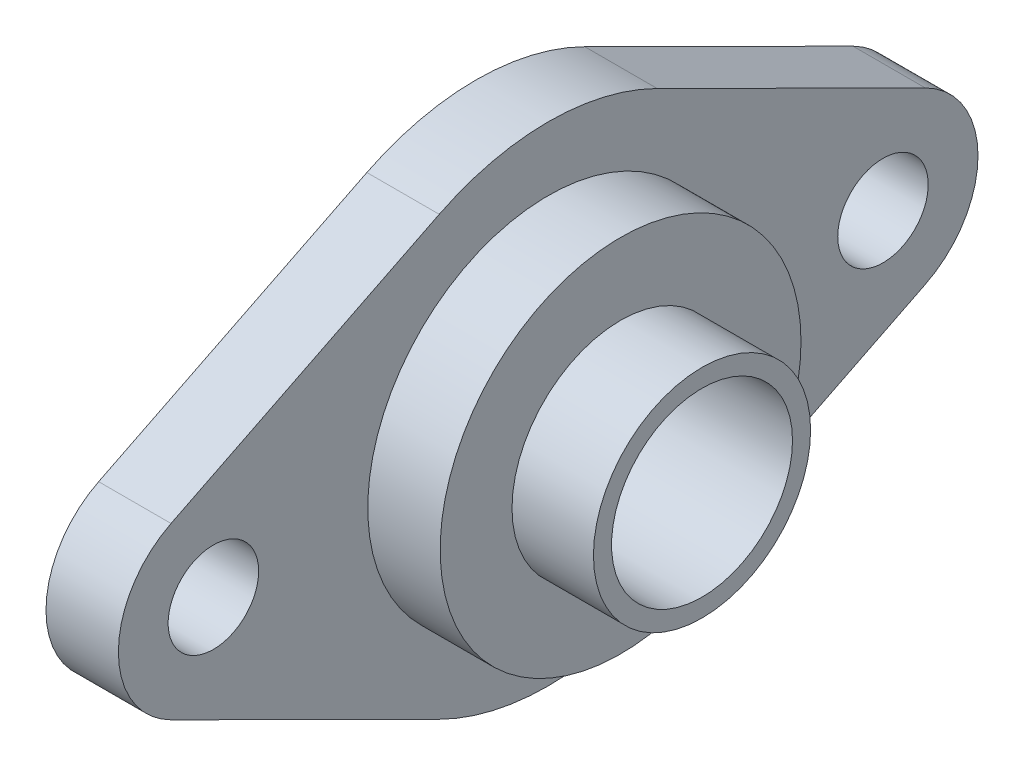
ISO-10303-21;
HEADER;
FILE_DESCRIPTION(('STEP AP214'),'2;1');
FILE_NAME('part.step','',(''),(''),'','','');
FILE_SCHEMA(('AUTOMOTIVE_DESIGN { 1 0 10303 214 1 1 1 1 }'));
ENDSEC;
DATA;
#1=APPLICATION_CONTEXT('core data for automotive mechanical design processes');
#2=APPLICATION_PROTOCOL_DEFINITION('international standard','automotive_design',2000,#1);
#3=PRODUCT_CONTEXT('',#1,'mechanical');
#4=PRODUCT('Part','Part','',(#3));
#5=PRODUCT_RELATED_PRODUCT_CATEGORY('part','',(#4));
#6=PRODUCT_DEFINITION_FORMATION('','',#4);
#7=PRODUCT_DEFINITION_CONTEXT('part definition',#1,'design');
#8=PRODUCT_DEFINITION('design','',#6,#7);
#9=PRODUCT_DEFINITION_SHAPE('','',#8);
#10=(LENGTH_UNIT() NAMED_UNIT(*) SI_UNIT(.MILLI.,.METRE.));
#11=(NAMED_UNIT(*) PLANE_ANGLE_UNIT() SI_UNIT($,.RADIAN.));
#12=(NAMED_UNIT(*) SI_UNIT($,.STERADIAN.) SOLID_ANGLE_UNIT());
#13=UNCERTAINTY_MEASURE_WITH_UNIT(LENGTH_MEASURE(1.E-05),#10,'distance_accuracy_value','');
#14=(GEOMETRIC_REPRESENTATION_CONTEXT(3) GLOBAL_UNCERTAINTY_ASSIGNED_CONTEXT((#13)) GLOBAL_UNIT_ASSIGNED_CONTEXT((#10,
#11,#12)) REPRESENTATION_CONTEXT('',''));
#15=CARTESIAN_POINT('',(0.,0.,0.));
#16=DIRECTION('',(0.,0.,1.));
#17=DIRECTION('',(1.,0.,0.));
#18=AXIS2_PLACEMENT_3D('',#15,#16,#17);
#19=CARTESIAN_POINT('',(4.,0.,18.5));
#20=DIRECTION('',(1.,0.,0.));
#21=DIRECTION('',(0.,0.,-1.));
#22=AXIS2_PLACEMENT_3D('',#19,#20,#21);
#23=PLANE('',#22);
#24=CARTESIAN_POINT('',(4.,0.,0.));
#25=DIRECTION('',(1.,0.,0.));
#26=DIRECTION('',(0.,0.,-1.));
#27=AXIS2_PLACEMENT_3D('',#24,#25,#26);
#28=CIRCLE('',#27,9.96974768784367);
#29=CARTESIAN_POINT('',(4.,0.,-9.96974768784367));
#30=VERTEX_POINT('',#29);
#31=EDGE_CURVE('E195',#30,#30,#28,.T.);
#32=ORIENTED_EDGE('',*,*,#31,.F.);
#33=EDGE_LOOP('',(#32));
#34=FACE_BOUND('',#33,.T.);
#35=CARTESIAN_POINT('',(4.,0.,18.5));
#36=DIRECTION('',(1.,0.,0.));
#37=DIRECTION('',(0.,0.,-1.));
#38=AXIS2_PLACEMENT_3D('',#35,#36,#37);
#39=CIRCLE('',#38,2.5);
#40=CARTESIAN_POINT('',(4.,0.,16.));
#41=VERTEX_POINT('',#40);
#42=EDGE_CURVE('E135',#41,#41,#39,.T.);
#43=ORIENTED_EDGE('',*,*,#42,.F.);
#44=EDGE_LOOP('',(#43));
#45=FACE_BOUND('',#44,.T.);
#46=CARTESIAN_POINT('',(4.,0.,18.5));
#47=DIRECTION('',(1.,0.,0.));
#48=DIRECTION('',(0.,0.,-1.));
#49=AXIS2_PLACEMENT_3D('',#46,#47,#48);
#50=CIRCLE('',#49,5.25);
#51=CARTESIAN_POINT('',(4.,4.69906444187843,20.8412162162162));
#52=VERTEX_POINT('',#51);
#53=CARTESIAN_POINT('',(4.,-4.69906444187843,20.8412162162162));
#54=VERTEX_POINT('',#53);
#55=EDGE_CURVE('E146',#52,#54,#50,.T.);
#56=ORIENTED_EDGE('',*,*,#55,.T.);
#57=DIRECTION('',(0.,-0.445945945945946,-0.895059893691129));
#58=VECTOR('',#57,1.);
#59=CARTESIAN_POINT('',(4.,-4.69906444187843,20.8412162162162));
#60=LINE('',#59,#58);
#61=CARTESIAN_POINT('',(4.,-12.0833085648303,6.02027027027028));
#62=VERTEX_POINT('',#61);
#63=EDGE_CURVE('E94',#54,#62,#60,.T.);
#64=ORIENTED_EDGE('',*,*,#63,.T.);
#65=CARTESIAN_POINT('',(4.,0.,0.));
#66=DIRECTION('',(1.,0.,0.));
#67=DIRECTION('',(0.,0.,-1.));
#68=AXIS2_PLACEMENT_3D('',#65,#66,#67);
#69=CIRCLE('',#68,13.5);
#70=CARTESIAN_POINT('',(4.,-12.0833085648302,-6.02027027027053));
#71=VERTEX_POINT('',#70);
#72=EDGE_CURVE('E177',#62,#71,#69,.T.);
#73=ORIENTED_EDGE('',*,*,#72,.T.);
#74=DIRECTION('',(0.,0.445945945945959,-0.895059893691123));
#75=VECTOR('',#74,1.);
#76=CARTESIAN_POINT('',(4.,-4.69906444187814,-20.8412162162164));
#77=LINE('',#76,#75);
#78=CARTESIAN_POINT('',(4.,-4.69906444187814,-20.8412162162164));
#79=VERTEX_POINT('',#78);
#80=EDGE_CURVE('E176',#71,#79,#77,.T.);
#81=ORIENTED_EDGE('',*,*,#80,.T.);
#82=CARTESIAN_POINT('',(4.,2.56624833116093E-13,-18.5000000000001));
#83=DIRECTION('',(1.,0.,0.));
#84=DIRECTION('',(0.,0.,1.));
#85=AXIS2_PLACEMENT_3D('',#82,#83,#84);
#86=CIRCLE('',#85,5.25);
#87=CARTESIAN_POINT('',(4.,4.69906444187872,-20.8412162162162));
#88=VERTEX_POINT('',#87);
#89=EDGE_CURVE('E113',#79,#88,#86,.T.);
#90=ORIENTED_EDGE('',*,*,#89,.T.);
#91=DIRECTION('',(0.,0.445945945945933,0.895059893691135));
#92=VECTOR('',#91,1.);
#93=CARTESIAN_POINT('',(4.,4.69906444187872,-20.8412162162162));
#94=LINE('',#93,#92);
#95=CARTESIAN_POINT('',(4.,12.0833085648303,-6.02027027027019));
#96=VERTEX_POINT('',#95);
#97=EDGE_CURVE('E107',#88,#96,#94,.T.);
#98=ORIENTED_EDGE('',*,*,#97,.T.);
#99=CARTESIAN_POINT('',(4.,0.,0.));
#100=DIRECTION('',(1.,0.,0.));
#101=DIRECTION('',(0.,0.,-1.));
#102=AXIS2_PLACEMENT_3D('',#99,#100,#101);
#103=CIRCLE('',#102,13.5);
#104=CARTESIAN_POINT('',(4.,12.0833085648302,6.02027027027027));
#105=VERTEX_POINT('',#104);
#106=EDGE_CURVE('E111',#96,#105,#103,.T.);
#107=ORIENTED_EDGE('',*,*,#106,.T.);
#108=DIRECTION('',(0.,-0.445945945945946,0.895059893691129));
#109=VECTOR('',#108,1.);
#110=CARTESIAN_POINT('',(4.,4.69906444187843,20.8412162162162));
#111=LINE('',#110,#109);
#112=EDGE_CURVE('E50',#105,#52,#111,.T.);
#113=ORIENTED_EDGE('',*,*,#112,.T.);
#114=EDGE_LOOP('',(#56,#64,#73,#81,#90,#98,#107,#113));
#115=FACE_BOUND('',#114,.T.);
#116=CARTESIAN_POINT('',(4.,2.56624833116093E-13,-18.5000000000001));
#117=DIRECTION('',(1.,0.,0.));
#118=DIRECTION('',(0.,0.,1.));
#119=AXIS2_PLACEMENT_3D('',#116,#117,#118);
#120=CIRCLE('',#119,2.5);
#121=CARTESIAN_POINT('',(4.,2.56624833116093E-13,-16.0000000000001));
#122=VERTEX_POINT('',#121);
#123=EDGE_CURVE('E186',#122,#122,#120,.T.);
#124=ORIENTED_EDGE('',*,*,#123,.F.);
#125=EDGE_LOOP('',(#124));
#126=FACE_BOUND('',#125,.T.);
#127=ADVANCED_FACE('F32',(#34,#45,#115,#126),#23,.T.);
#128=CARTESIAN_POINT('',(0.,0.,18.5));
#129=DIRECTION('',(1.,0.,0.));
#130=DIRECTION('',(0.,0.,-1.));
#131=AXIS2_PLACEMENT_3D('',#128,#129,#130);
#132=PLANE('',#131);
#133=CARTESIAN_POINT('',(0.,0.,0.));
#134=DIRECTION('',(1.,0.,0.));
#135=DIRECTION('',(0.,0.,-1.));
#136=AXIS2_PLACEMENT_3D('',#133,#134,#135);
#137=CIRCLE('',#136,5.);
#138=CARTESIAN_POINT('',(0.,0.,-5.));
#139=VERTEX_POINT('',#138);
#140=EDGE_CURVE('E203',#139,#139,#137,.T.);
#141=ORIENTED_EDGE('',*,*,#140,.T.);
#142=EDGE_LOOP('',(#141));
#143=FACE_BOUND('',#142,.T.);
#144=CARTESIAN_POINT('',(0.,0.,18.5));
#145=DIRECTION('',(1.,0.,0.));
#146=DIRECTION('',(0.,0.,-1.));
#147=AXIS2_PLACEMENT_3D('',#144,#145,#146);
#148=CIRCLE('',#147,5.25);
#149=CARTESIAN_POINT('',(0.,4.69906444187843,20.8412162162162));
#150=VERTEX_POINT('',#149);
#151=CARTESIAN_POINT('',(0.,-4.69906444187843,20.8412162162162));
#152=VERTEX_POINT('',#151);
#153=EDGE_CURVE('E131',#150,#152,#148,.T.);
#154=ORIENTED_EDGE('',*,*,#153,.F.);
#155=DIRECTION('',(0.,-0.445945945945946,0.895059893691129));
#156=VECTOR('',#155,1.);
#157=CARTESIAN_POINT('',(0.,4.69906444187843,20.8412162162162));
#158=LINE('',#157,#156);
#159=CARTESIAN_POINT('',(0.,12.0833085648302,6.02027027027027));
#160=VERTEX_POINT('',#159);
#161=EDGE_CURVE('E85',#160,#150,#158,.T.);
#162=ORIENTED_EDGE('',*,*,#161,.F.);
#163=CARTESIAN_POINT('',(0.,0.,0.));
#164=DIRECTION('',(1.,0.,0.));
#165=DIRECTION('',(0.,0.,-1.));
#166=AXIS2_PLACEMENT_3D('',#163,#164,#165);
#167=CIRCLE('',#166,13.5);
#168=CARTESIAN_POINT('',(0.,12.0833085648303,-6.02027027027019));
#169=VERTEX_POINT('',#168);
#170=EDGE_CURVE('E79',#169,#160,#167,.T.);
#171=ORIENTED_EDGE('',*,*,#170,.F.);
#172=DIRECTION('',(0.,0.445945945945933,0.895059893691135));
#173=VECTOR('',#172,1.);
#174=CARTESIAN_POINT('',(0.,4.69906444187872,-20.8412162162162));
#175=LINE('',#174,#173);
#176=CARTESIAN_POINT('',(0.,4.69906444187872,-20.8412162162162));
#177=VERTEX_POINT('',#176);
#178=EDGE_CURVE('E121',#177,#169,#175,.T.);
#179=ORIENTED_EDGE('',*,*,#178,.F.);
#180=CARTESIAN_POINT('',(0.,2.56624833116093E-13,-18.5000000000001));
#181=DIRECTION('',(1.,0.,0.));
#182=DIRECTION('',(0.,0.,1.));
#183=AXIS2_PLACEMENT_3D('',#180,#181,#182);
#184=CIRCLE('',#183,5.25);
#185=CARTESIAN_POINT('',(0.,-4.69906444187814,-20.8412162162164));
#186=VERTEX_POINT('',#185);
#187=EDGE_CURVE('E141',#186,#177,#184,.T.);
#188=ORIENTED_EDGE('',*,*,#187,.F.);
#189=DIRECTION('',(0.,0.445945945945959,-0.895059893691123));
#190=VECTOR('',#189,1.);
#191=CARTESIAN_POINT('',(0.,-4.69906444187814,-20.8412162162164));
#192=LINE('',#191,#190);
#193=CARTESIAN_POINT('',(0.,-12.0833085648302,-6.02027027027053));
#194=VERTEX_POINT('',#193);
#195=EDGE_CURVE('E139',#194,#186,#192,.T.);
#196=ORIENTED_EDGE('',*,*,#195,.F.);
#197=CARTESIAN_POINT('',(0.,0.,0.));
#198=DIRECTION('',(1.,0.,0.));
#199=DIRECTION('',(0.,0.,-1.));
#200=AXIS2_PLACEMENT_3D('',#197,#198,#199);
#201=CIRCLE('',#200,13.5);
#202=CARTESIAN_POINT('',(0.,-12.0833085648303,6.02027027027028));
#203=VERTEX_POINT('',#202);
#204=EDGE_CURVE('E137',#203,#194,#201,.T.);
#205=ORIENTED_EDGE('',*,*,#204,.F.);
#206=DIRECTION('',(0.,-0.445945945945946,-0.895059893691129));
#207=VECTOR('',#206,1.);
#208=CARTESIAN_POINT('',(0.,-4.69906444187843,20.8412162162162));
#209=LINE('',#208,#207);
#210=EDGE_CURVE('E134',#152,#203,#209,.T.);
#211=ORIENTED_EDGE('',*,*,#210,.F.);
#212=EDGE_LOOP('',(#154,#162,#171,#179,#188,#196,#205,#211));
#213=FACE_BOUND('',#212,.T.);
#214=CARTESIAN_POINT('',(0.,0.,18.5));
#215=DIRECTION('',(1.,0.,0.));
#216=DIRECTION('',(0.,0.,-1.));
#217=AXIS2_PLACEMENT_3D('',#214,#215,#216);
#218=CIRCLE('',#217,2.5);
#219=CARTESIAN_POINT('',(0.,0.,16.));
#220=VERTEX_POINT('',#219);
#221=EDGE_CURVE('E183',#220,#220,#218,.T.);
#222=ORIENTED_EDGE('',*,*,#221,.T.);
#223=EDGE_LOOP('',(#222));
#224=FACE_BOUND('',#223,.T.);
#225=CARTESIAN_POINT('',(0.,2.56624833116093E-13,-18.5000000000001));
#226=DIRECTION('',(1.,0.,0.));
#227=DIRECTION('',(0.,0.,1.));
#228=AXIS2_PLACEMENT_3D('',#225,#226,#227);
#229=CIRCLE('',#228,2.5);
#230=CARTESIAN_POINT('',(0.,2.56624833116093E-13,-16.0000000000001));
#231=VERTEX_POINT('',#230);
#232=EDGE_CURVE('E189',#231,#231,#229,.T.);
#233=ORIENTED_EDGE('',*,*,#232,.T.);
#234=EDGE_LOOP('',(#233));
#235=FACE_BOUND('',#234,.T.);
#236=ADVANCED_FACE('F166',(#143,#213,#224,#235),#132,.F.);
#237=CARTESIAN_POINT('',(4.,0.,18.5));
#238=DIRECTION('',(-1.,0.,0.));
#239=DIRECTION('',(0.,0.,1.));
#240=AXIS2_PLACEMENT_3D('',#237,#238,#239);
#241=CYLINDRICAL_SURFACE('',#240,5.25);
#242=ORIENTED_EDGE('',*,*,#153,.T.);
#243=DIRECTION('',(-1.,0.,0.));
#244=VECTOR('',#243,1.);
#245=CARTESIAN_POINT('',(4.,-4.69906444187843,20.8412162162162));
#246=LINE('',#245,#244);
#247=EDGE_CURVE('E36',#54,#152,#246,.T.);
#248=ORIENTED_EDGE('',*,*,#247,.F.);
#249=ORIENTED_EDGE('',*,*,#55,.F.);
#250=DIRECTION('',(-1.,0.,0.));
#251=VECTOR('',#250,1.);
#252=CARTESIAN_POINT('',(4.,4.69906444187843,20.8412162162162));
#253=LINE('',#252,#251);
#254=EDGE_CURVE('E127',#52,#150,#253,.T.);
#255=ORIENTED_EDGE('',*,*,#254,.T.);
#256=EDGE_LOOP('',(#242,#248,#249,#255));
#257=FACE_BOUND('',#256,.T.);
#258=ADVANCED_FACE('F34',(#257),#241,.T.);
#259=CARTESIAN_POINT('',(4.,-4.69906444187843,20.8412162162162));
#260=DIRECTION('',(0.,0.895059893691129,-0.445945945945946));
#261=DIRECTION('',(0.,0.445945945945946,0.895059893691129));
#262=AXIS2_PLACEMENT_3D('',#259,#260,#261);
#263=PLANE('',#262);
#264=ORIENTED_EDGE('',*,*,#210,.T.);
#265=DIRECTION('',(-1.,0.,0.));
#266=VECTOR('',#265,1.);
#267=CARTESIAN_POINT('',(4.,-12.0833085648303,6.02027027027028));
#268=LINE('',#267,#266);
#269=EDGE_CURVE('E155',#62,#203,#268,.T.);
#270=ORIENTED_EDGE('',*,*,#269,.F.);
#271=ORIENTED_EDGE('',*,*,#63,.F.);
#272=ORIENTED_EDGE('',*,*,#247,.T.);
#273=EDGE_LOOP('',(#264,#270,#271,#272));
#274=FACE_BOUND('',#273,.T.);
#275=ADVANCED_FACE('F161',(#274),#263,.F.);
#276=CARTESIAN_POINT('',(4.,0.,0.));
#277=DIRECTION('',(-1.,0.,0.));
#278=DIRECTION('',(0.,0.,1.));
#279=AXIS2_PLACEMENT_3D('',#276,#277,#278);
#280=CYLINDRICAL_SURFACE('',#279,13.5);
#281=ORIENTED_EDGE('',*,*,#204,.T.);
#282=DIRECTION('',(-1.,0.,0.));
#283=VECTOR('',#282,1.);
#284=CARTESIAN_POINT('',(4.,-12.0833085648302,-6.02027027027053));
#285=LINE('',#284,#283);
#286=EDGE_CURVE('E153',#71,#194,#285,.T.);
#287=ORIENTED_EDGE('',*,*,#286,.F.);
#288=ORIENTED_EDGE('',*,*,#72,.F.);
#289=ORIENTED_EDGE('',*,*,#269,.T.);
#290=EDGE_LOOP('',(#281,#287,#288,#289));
#291=FACE_BOUND('',#290,.T.);
#292=ADVANCED_FACE('F171',(#291),#280,.T.);
#293=CARTESIAN_POINT('',(4.,-4.69906444187814,-20.8412162162164));
#294=DIRECTION('',(0.,0.895059893691123,0.445945945945959));
#295=DIRECTION('',(0.,-0.445945945945959,0.895059893691123));
#296=AXIS2_PLACEMENT_3D('',#293,#294,#295);
#297=PLANE('',#296);
#298=ORIENTED_EDGE('',*,*,#195,.T.);
#299=DIRECTION('',(-1.,0.,0.));
#300=VECTOR('',#299,1.);
#301=CARTESIAN_POINT('',(4.,-4.69906444187814,-20.8412162162164));
#302=LINE('',#301,#300);
#303=EDGE_CURVE('E150',#79,#186,#302,.T.);
#304=ORIENTED_EDGE('',*,*,#303,.F.);
#305=ORIENTED_EDGE('',*,*,#80,.F.);
#306=ORIENTED_EDGE('',*,*,#286,.T.);
#307=EDGE_LOOP('',(#298,#304,#305,#306));
#308=FACE_BOUND('',#307,.T.);
#309=ADVANCED_FACE('F174',(#308),#297,.F.);
#310=CARTESIAN_POINT('',(4.,2.56624833116093E-13,-18.5000000000001));
#311=DIRECTION('',(-1.,0.,0.));
#312=DIRECTION('',(0.,0.,1.));
#313=AXIS2_PLACEMENT_3D('',#310,#311,#312);
#314=CYLINDRICAL_SURFACE('',#313,5.25);
#315=ORIENTED_EDGE('',*,*,#187,.T.);
#316=DIRECTION('',(-1.,0.,0.));
#317=VECTOR('',#316,1.);
#318=CARTESIAN_POINT('',(4.,4.69906444187872,-20.8412162162162));
#319=LINE('',#318,#317);
#320=EDGE_CURVE('E122',#88,#177,#319,.T.);
#321=ORIENTED_EDGE('',*,*,#320,.F.);
#322=ORIENTED_EDGE('',*,*,#89,.F.);
#323=ORIENTED_EDGE('',*,*,#303,.T.);
#324=EDGE_LOOP('',(#315,#321,#322,#323));
#325=FACE_BOUND('',#324,.T.);
#326=ADVANCED_FACE('F270',(#325),#314,.T.);
#327=CARTESIAN_POINT('',(4.,4.69906444187872,-20.8412162162162));
#328=DIRECTION('',(0.,-0.895059893691136,0.445945945945933));
#329=DIRECTION('',(0.,-0.445945945945933,-0.895059893691135));
#330=AXIS2_PLACEMENT_3D('',#327,#328,#329);
#331=PLANE('',#330);
#332=ORIENTED_EDGE('',*,*,#178,.T.);
#333=DIRECTION('',(-1.,0.,0.));
#334=VECTOR('',#333,1.);
#335=CARTESIAN_POINT('',(4.,12.0833085648303,-6.02027027027019));
#336=LINE('',#335,#334);
#337=EDGE_CURVE('E118',#96,#169,#336,.T.);
#338=ORIENTED_EDGE('',*,*,#337,.F.);
#339=ORIENTED_EDGE('',*,*,#97,.F.);
#340=ORIENTED_EDGE('',*,*,#320,.T.);
#341=EDGE_LOOP('',(#332,#338,#339,#340));
#342=FACE_BOUND('',#341,.T.);
#343=ADVANCED_FACE('F119',(#342),#331,.F.);
#344=CARTESIAN_POINT('',(4.,0.,0.));
#345=DIRECTION('',(-1.,0.,0.));
#346=DIRECTION('',(0.,0.,1.));
#347=AXIS2_PLACEMENT_3D('',#344,#345,#346);
#348=CYLINDRICAL_SURFACE('',#347,13.5);
#349=ORIENTED_EDGE('',*,*,#170,.T.);
#350=DIRECTION('',(-1.,0.,0.));
#351=VECTOR('',#350,1.);
#352=CARTESIAN_POINT('',(4.,12.0833085648302,6.02027027027027));
#353=LINE('',#352,#351);
#354=EDGE_CURVE('E123',#105,#160,#353,.T.);
#355=ORIENTED_EDGE('',*,*,#354,.F.);
#356=ORIENTED_EDGE('',*,*,#106,.F.);
#357=ORIENTED_EDGE('',*,*,#337,.T.);
#358=EDGE_LOOP('',(#349,#355,#356,#357));
#359=FACE_BOUND('',#358,.T.);
#360=ADVANCED_FACE('F125',(#359),#348,.T.);
#361=CARTESIAN_POINT('',(4.,4.69906444187843,20.8412162162162));
#362=DIRECTION('',(0.,-0.895059893691129,-0.445945945945946));
#363=DIRECTION('',(0.,0.445945945945946,-0.895059893691129));
#364=AXIS2_PLACEMENT_3D('',#361,#362,#363);
#365=PLANE('',#364);
#366=ORIENTED_EDGE('',*,*,#161,.T.);
#367=ORIENTED_EDGE('',*,*,#254,.F.);
#368=ORIENTED_EDGE('',*,*,#112,.F.);
#369=ORIENTED_EDGE('',*,*,#354,.T.);
#370=EDGE_LOOP('',(#366,#367,#368,#369));
#371=FACE_BOUND('',#370,.T.);
#372=ADVANCED_FACE('F250',(#371),#365,.F.);
#373=CARTESIAN_POINT('',(4.,0.,18.5));
#374=DIRECTION('',(-1.,0.,0.));
#375=DIRECTION('',(0.,0.,1.));
#376=AXIS2_PLACEMENT_3D('',#373,#374,#375);
#377=CYLINDRICAL_SURFACE('',#376,2.5);
#378=ORIENTED_EDGE('',*,*,#42,.T.);
#379=EDGE_LOOP('',(#378));
#380=FACE_BOUND('',#379,.T.);
#381=ORIENTED_EDGE('',*,*,#221,.F.);
#382=EDGE_LOOP('',(#381));
#383=FACE_BOUND('',#382,.T.);
#384=ADVANCED_FACE('F247',(#380,#383),#377,.F.);
#385=CARTESIAN_POINT('',(4.,2.56624833116093E-13,-18.5000000000001));
#386=DIRECTION('',(-1.,0.,0.));
#387=DIRECTION('',(0.,0.,1.));
#388=AXIS2_PLACEMENT_3D('',#385,#386,#387);
#389=CYLINDRICAL_SURFACE('',#388,2.5);
#390=ORIENTED_EDGE('',*,*,#123,.T.);
#391=EDGE_LOOP('',(#390));
#392=FACE_BOUND('',#391,.T.);
#393=ORIENTED_EDGE('',*,*,#232,.F.);
#394=EDGE_LOOP('',(#393));
#395=FACE_BOUND('',#394,.T.);
#396=ADVANCED_FACE('F238',(#392,#395),#389,.F.);
#397=CARTESIAN_POINT('',(8.,0.,0.));
#398=DIRECTION('',(-1.,0.,0.));
#399=DIRECTION('',(0.,0.,1.));
#400=AXIS2_PLACEMENT_3D('',#397,#398,#399);
#401=CYLINDRICAL_SURFACE('',#400,9.96974768784367);
#402=CARTESIAN_POINT('',(8.,0.,0.));
#403=DIRECTION('',(1.,0.,0.));
#404=DIRECTION('',(0.,0.,-1.));
#405=AXIS2_PLACEMENT_3D('',#402,#403,#404);
#406=CIRCLE('',#405,9.96974768784367);
#407=CARTESIAN_POINT('',(8.,0.,-9.96974768784367));
#408=VERTEX_POINT('',#407);
#409=EDGE_CURVE('E192',#408,#408,#406,.T.);
#410=ORIENTED_EDGE('',*,*,#409,.F.);
#411=EDGE_LOOP('',(#410));
#412=FACE_BOUND('',#411,.T.);
#413=ORIENTED_EDGE('',*,*,#31,.T.);
#414=EDGE_LOOP('',(#413));
#415=FACE_BOUND('',#414,.T.);
#416=ADVANCED_FACE('F232',(#412,#415),#401,.T.);
#417=CARTESIAN_POINT('',(8.,0.,0.));
#418=DIRECTION('',(1.,0.,0.));
#419=DIRECTION('',(0.,0.,-1.));
#420=AXIS2_PLACEMENT_3D('',#417,#418,#419);
#421=PLANE('',#420);
#422=CARTESIAN_POINT('',(8.,0.,0.));
#423=DIRECTION('',(1.,0.,0.));
#424=DIRECTION('',(0.,0.,-1.));
#425=AXIS2_PLACEMENT_3D('',#422,#423,#424);
#426=CIRCLE('',#425,6.);
#427=CARTESIAN_POINT('',(8.,0.,-6.));
#428=VERTEX_POINT('',#427);
#429=EDGE_CURVE('E11',#428,#428,#426,.T.);
#430=ORIENTED_EDGE('',*,*,#429,.F.);
#431=EDGE_LOOP('',(#430));
#432=FACE_BOUND('',#431,.T.);
#433=ORIENTED_EDGE('',*,*,#409,.T.);
#434=EDGE_LOOP('',(#433));
#435=FACE_BOUND('',#434,.T.);
#436=ADVANCED_FACE('F226',(#432,#435),#421,.T.);
#437=CARTESIAN_POINT('',(12.5,0.,0.));
#438=DIRECTION('',(-1.,0.,0.));
#439=DIRECTION('',(0.,0.,1.));
#440=AXIS2_PLACEMENT_3D('',#437,#438,#439);
#441=CYLINDRICAL_SURFACE('',#440,6.);
#442=CARTESIAN_POINT('',(12.5,0.,0.));
#443=DIRECTION('',(1.,0.,0.));
#444=DIRECTION('',(0.,0.,-1.));
#445=AXIS2_PLACEMENT_3D('',#442,#443,#444);
#446=CIRCLE('',#445,6.);
#447=CARTESIAN_POINT('',(12.5,0.,-6.));
#448=VERTEX_POINT('',#447);
#449=EDGE_CURVE('E198',#448,#448,#446,.T.);
#450=ORIENTED_EDGE('',*,*,#449,.F.);
#451=EDGE_LOOP('',(#450));
#452=FACE_BOUND('',#451,.T.);
#453=ORIENTED_EDGE('',*,*,#429,.T.);
#454=EDGE_LOOP('',(#453));
#455=FACE_BOUND('',#454,.T.);
#456=ADVANCED_FACE('F220',(#452,#455),#441,.T.);
#457=CARTESIAN_POINT('',(12.5,0.,0.));
#458=DIRECTION('',(1.,0.,0.));
#459=DIRECTION('',(0.,0.,-1.));
#460=AXIS2_PLACEMENT_3D('',#457,#458,#459);
#461=PLANE('',#460);
#462=CARTESIAN_POINT('',(12.5,0.,0.));
#463=DIRECTION('',(1.,0.,0.));
#464=DIRECTION('',(0.,0.,-1.));
#465=AXIS2_PLACEMENT_3D('',#462,#463,#464);
#466=CIRCLE('',#465,5.);
#467=CARTESIAN_POINT('',(12.5,0.,-5.));
#468=VERTEX_POINT('',#467);
#469=EDGE_CURVE('E204',#468,#468,#466,.T.);
#470=ORIENTED_EDGE('',*,*,#469,.F.);
#471=EDGE_LOOP('',(#470));
#472=FACE_BOUND('',#471,.T.);
#473=ORIENTED_EDGE('',*,*,#449,.T.);
#474=EDGE_LOOP('',(#473));
#475=FACE_BOUND('',#474,.T.);
#476=ADVANCED_FACE('F214',(#472,#475),#461,.T.);
#477=CARTESIAN_POINT('',(0.,0.,0.));
#478=DIRECTION('',(1.,0.,0.));
#479=DIRECTION('',(0.,0.,-1.));
#480=AXIS2_PLACEMENT_3D('',#477,#478,#479);
#481=CYLINDRICAL_SURFACE('',#480,5.);
#482=ORIENTED_EDGE('',*,*,#140,.F.);
#483=EDGE_LOOP('',(#482));
#484=FACE_BOUND('',#483,.T.);
#485=ORIENTED_EDGE('',*,*,#469,.T.);
#486=EDGE_LOOP('',(#485));
#487=FACE_BOUND('',#486,.T.);
#488=ADVANCED_FACE('F211',(#484,#487),#481,.F.);
#489=CLOSED_SHELL('',(#127,#236,#258,#275,#292,#309,#326,#343,#360,#372,#384,#396,#416,#436,
#456,#476,#488));
#490=MANIFOLD_SOLID_BREP('B2',#489);
#491=ADVANCED_BREP_SHAPE_REPRESENTATION('',(#18,#490),#14);
#492=SHAPE_DEFINITION_REPRESENTATION(#9,#491);
ENDSEC;
END-ISO-10303-21;
